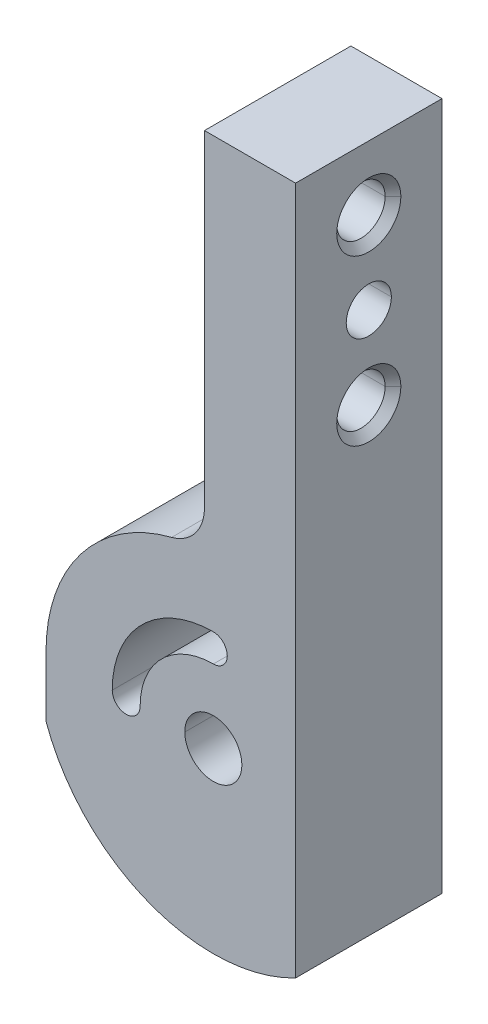
ISO-10303-21;
HEADER;
FILE_DESCRIPTION(('STEP AP214'),'2;1');
FILE_NAME('part.step','',(''),(''),'','','');
FILE_SCHEMA(('AUTOMOTIVE_DESIGN { 1 0 10303 214 1 1 1 1 }'));
ENDSEC;
DATA;
#1=APPLICATION_CONTEXT('core data for automotive mechanical design processes');
#2=APPLICATION_PROTOCOL_DEFINITION('international standard','automotive_design',2000,#1);
#3=PRODUCT_CONTEXT('',#1,'mechanical');
#4=PRODUCT('Part','Part','',(#3));
#5=PRODUCT_RELATED_PRODUCT_CATEGORY('part','',(#4));
#6=PRODUCT_DEFINITION_FORMATION('','',#4);
#7=PRODUCT_DEFINITION_CONTEXT('part definition',#1,'design');
#8=PRODUCT_DEFINITION('design','',#6,#7);
#9=PRODUCT_DEFINITION_SHAPE('','',#8);
#10=(LENGTH_UNIT() NAMED_UNIT(*) SI_UNIT(.MILLI.,.METRE.));
#11=(NAMED_UNIT(*) PLANE_ANGLE_UNIT() SI_UNIT($,.RADIAN.));
#12=(NAMED_UNIT(*) SI_UNIT($,.STERADIAN.) SOLID_ANGLE_UNIT());
#13=UNCERTAINTY_MEASURE_WITH_UNIT(LENGTH_MEASURE(1.E-05),#10,'distance_accuracy_value','');
#14=(GEOMETRIC_REPRESENTATION_CONTEXT(3) GLOBAL_UNCERTAINTY_ASSIGNED_CONTEXT((#13)) GLOBAL_UNIT_ASSIGNED_CONTEXT((#10,
#11,#12)) REPRESENTATION_CONTEXT('',''));
#15=CARTESIAN_POINT('',(0.,0.,0.));
#16=DIRECTION('',(0.,0.,1.));
#17=DIRECTION('',(1.,0.,0.));
#18=AXIS2_PLACEMENT_3D('',#15,#16,#17);
#19=CARTESIAN_POINT('',(-2.8702000000001,11.1686951126799,-8.001));
#20=DIRECTION('',(0.,0.,-1.));
#21=DIRECTION('',(-0.790221069832412,0.612821883415498,0.));
#22=AXIS2_PLACEMENT_3D('',#19,#20,#21);
#23=CYLINDRICAL_SURFACE('',#22,2.38760000000011);
#24=DIRECTION('',(0.,0.,1.));
#25=VECTOR('',#24,1.);
#26=CARTESIAN_POINT('',(-2.2759295154185,8.85623401005449,-8.001));
#27=LINE('',#26,#25);
#28=CARTESIAN_POINT('',(-2.2759295154185,8.85623401005449,-8.001));
#29=VERTEX_POINT('',#28);
#30=CARTESIAN_POINT('',(-2.2759295154185,8.85623401005449,0.));
#31=VERTEX_POINT('',#30);
#32=EDGE_CURVE('E11',#29,#31,#27,.T.);
#33=ORIENTED_EDGE('',*,*,#32,.T.);
#34=CARTESIAN_POINT('',(-2.8702000000001,11.1686951126799,0.));
#35=DIRECTION('',(0.,0.,1.));
#36=DIRECTION('',(1.,0.,0.));
#37=AXIS2_PLACEMENT_3D('',#34,#35,#36);
#38=CIRCLE('',#37,2.38760000000011);
#39=CARTESIAN_POINT('',(-0.4826,11.16869511268,0.));
#40=VERTEX_POINT('',#39);
#41=EDGE_CURVE('E25',#31,#40,#38,.T.);
#42=ORIENTED_EDGE('',*,*,#41,.T.);
#43=DIRECTION('',(0.,0.,1.));
#44=VECTOR('',#43,1.);
#45=CARTESIAN_POINT('',(-0.4826,11.16869511268,-8.001));
#46=LINE('',#45,#44);
#47=CARTESIAN_POINT('',(-0.4826,11.16869511268,-8.001));
#48=VERTEX_POINT('',#47);
#49=EDGE_CURVE('E793',#48,#40,#46,.T.);
#50=ORIENTED_EDGE('',*,*,#49,.F.);
#51=CARTESIAN_POINT('',(-2.8702000000001,11.1686951126799,-8.001));
#52=DIRECTION('',(0.,0.,1.));
#53=DIRECTION('',(1.,0.,0.));
#54=AXIS2_PLACEMENT_3D('',#51,#52,#53);
#55=CIRCLE('',#54,2.38760000000011);
#56=EDGE_CURVE('E788',#29,#48,#55,.T.);
#57=ORIENTED_EDGE('',*,*,#56,.F.);
#58=EDGE_LOOP('',(#33,#42,#50,#57));
#59=FACE_BOUND('',#58,.T.);
#60=ADVANCED_FACE('F17',(#59),#23,.F.);
#61=CARTESIAN_POINT('',(-2.5587171270658E-13,1.4658413372004E-13,-8.001));
#62=DIRECTION('',(0.,0.,1.));
#63=DIRECTION('',(1.,0.,0.));
#64=AXIS2_PLACEMENT_3D('',#61,#62,#63);
#65=PLANE('',#64);
#66=CARTESIAN_POINT('',(0.,4.7625,-8.001));
#67=DIRECTION('',(0.,0.,1.));
#68=DIRECTION('',(1.,0.,0.));
#69=AXIS2_PLACEMENT_3D('',#66,#67,#68);
#70=CIRCLE('',#69,0.762);
#71=CARTESIAN_POINT('',(0.,4.0005,-8.001));
#72=VERTEX_POINT('',#71);
#73=CARTESIAN_POINT('',(0.,5.5245,-8.001));
#74=VERTEX_POINT('',#73);
#75=EDGE_CURVE('E784',#72,#74,#70,.T.);
#76=ORIENTED_EDGE('',*,*,#75,.T.);
#77=CARTESIAN_POINT('',(0.,0.,-8.001));
#78=DIRECTION('',(0.,0.,1.));
#79=DIRECTION('',(1.,0.,0.));
#80=AXIS2_PLACEMENT_3D('',#77,#78,#79);
#81=CIRCLE('',#80,5.52449999999995);
#82=CARTESIAN_POINT('',(-5.5245,1.1354684584634E-08,-8.001));
#83=VERTEX_POINT('',#82);
#84=EDGE_CURVE('E780',#74,#83,#81,.T.);
#85=ORIENTED_EDGE('',*,*,#84,.T.);
#86=CARTESIAN_POINT('',(-4.7625,0.,-8.001));
#87=DIRECTION('',(0.,0.,1.));
#88=DIRECTION('',(1.,0.,0.));
#89=AXIS2_PLACEMENT_3D('',#86,#87,#88);
#90=CIRCLE('',#89,0.762);
#91=CARTESIAN_POINT('',(-4.0005,2.53898475151004E-08,-8.001));
#92=VERTEX_POINT('',#91);
#93=EDGE_CURVE('E776',#83,#92,#90,.T.);
#94=ORIENTED_EDGE('',*,*,#93,.T.);
#95=CARTESIAN_POINT('',(0.,0.,-8.001));
#96=DIRECTION('',(0.,0.,1.));
#97=DIRECTION('',(1.,0.,0.));
#98=AXIS2_PLACEMENT_3D('',#95,#96,#97);
#99=CIRCLE('',#98,4.00049999999995);
#100=EDGE_CURVE('E771',#72,#92,#99,.T.);
#101=ORIENTED_EDGE('',*,*,#100,.F.);
#102=EDGE_LOOP('',(#76,#85,#94,#101));
#103=FACE_BOUND('',#102,.T.);
#104=CARTESIAN_POINT('',(0.,0.,-8.001));
#105=DIRECTION('',(0.,0.,1.));
#106=DIRECTION('',(1.,0.,0.));
#107=AXIS2_PLACEMENT_3D('',#104,#105,#106);
#108=CIRCLE('',#107,1.55956);
#109=CARTESIAN_POINT('',(1.55956,0.,-8.001));
#110=VERTEX_POINT('',#109);
#111=CARTESIAN_POINT('',(-1.55956,0.,-8.001));
#112=VERTEX_POINT('',#111);
#113=EDGE_CURVE('E767',#110,#112,#108,.T.);
#114=ORIENTED_EDGE('',*,*,#113,.T.);
#115=CARTESIAN_POINT('',(0.,0.,-8.001));
#116=DIRECTION('',(0.,0.,1.));
#117=DIRECTION('',(1.,0.,0.));
#118=AXIS2_PLACEMENT_3D('',#115,#116,#117);
#119=CIRCLE('',#118,1.55956);
#120=EDGE_CURVE('E763',#112,#110,#119,.T.);
#121=ORIENTED_EDGE('',*,*,#120,.T.);
#122=EDGE_LOOP('',(#114,#121));
#123=FACE_BOUND('',#122,.T.);
#124=CARTESIAN_POINT('',(-2.5587171270658E-13,1.4658413372004E-13,-8.001));
#125=DIRECTION('',(0.,0.,1.));
#126=DIRECTION('',(1.,0.,0.));
#127=AXIS2_PLACEMENT_3D('',#124,#125,#126);
#128=CIRCLE('',#127,9.14399999999975);
#129=CARTESIAN_POINT('',(-9.144,0.,-8.001));
#130=VERTEX_POINT('',#129);
#131=EDGE_CURVE('E758',#29,#130,#128,.T.);
#132=ORIENTED_EDGE('',*,*,#131,.F.);
#133=ORIENTED_EDGE('',*,*,#56,.T.);
#134=DIRECTION('',(0.,-1.,0.));
#135=VECTOR('',#134,1.);
#136=CARTESIAN_POINT('',(-0.4826,29.0068,-8.001));
#137=LINE('',#136,#135);
#138=CARTESIAN_POINT('',(-0.4826,29.0068,-8.001));
#139=VERTEX_POINT('',#138);
#140=EDGE_CURVE('E753',#139,#48,#137,.T.);
#141=ORIENTED_EDGE('',*,*,#140,.F.);
#142=DIRECTION('',(-1.,0.,0.));
#143=VECTOR('',#142,1.);
#144=CARTESIAN_POINT('',(4.4958,29.0068,-8.001));
#145=LINE('',#144,#143);
#146=CARTESIAN_POINT('',(4.4958,29.0068,-8.001));
#147=VERTEX_POINT('',#146);
#148=EDGE_CURVE('E748',#147,#139,#145,.T.);
#149=ORIENTED_EDGE('',*,*,#148,.F.);
#150=DIRECTION('',(0.,1.,0.));
#151=VECTOR('',#150,1.);
#152=CARTESIAN_POINT('',(4.4958,-8.61270704308471,-8.001));
#153=LINE('',#152,#151);
#154=CARTESIAN_POINT('',(4.4958,-8.61270704308471,-8.001));
#155=VERTEX_POINT('',#154);
#156=EDGE_CURVE('E743',#155,#147,#153,.T.);
#157=ORIENTED_EDGE('',*,*,#156,.F.);
#158=CARTESIAN_POINT('',(0.,1.48318857196017E-13,-8.001));
#159=DIRECTION('',(0.,0.,1.));
#160=DIRECTION('',(1.,0.,0.));
#161=AXIS2_PLACEMENT_3D('',#158,#159,#160);
#162=CIRCLE('',#161,9.71550000000013);
#163=CARTESIAN_POINT('',(-9.144,-3.28301755249649,-8.001));
#164=VERTEX_POINT('',#163);
#165=EDGE_CURVE('E738',#164,#155,#162,.T.);
#166=ORIENTED_EDGE('',*,*,#165,.F.);
#167=DIRECTION('',(0.,-1.,0.));
#168=VECTOR('',#167,1.);
#169=CARTESIAN_POINT('',(-9.144,0.,-8.001));
#170=LINE('',#169,#168);
#171=EDGE_CURVE('E733',#130,#164,#170,.T.);
#172=ORIENTED_EDGE('',*,*,#171,.F.);
#173=EDGE_LOOP('',(#132,#133,#141,#149,#157,#166,#172));
#174=FACE_BOUND('',#173,.T.);
#175=ADVANCED_FACE('F815',(#103,#123,#174),#65,.F.);
#176=CARTESIAN_POINT('',(-9.144,0.,-8.001));
#177=DIRECTION('',(-1.,0.,0.));
#178=DIRECTION('',(0.,0.,1.));
#179=AXIS2_PLACEMENT_3D('',#176,#177,#178);
#180=PLANE('',#179);
#181=DIRECTION('',(0.,-1.,0.));
#182=VECTOR('',#181,1.);
#183=CARTESIAN_POINT('',(-9.144,0.,0.));
#184=LINE('',#183,#182);
#185=CARTESIAN_POINT('',(-9.144,0.,0.));
#186=VERTEX_POINT('',#185);
#187=CARTESIAN_POINT('',(-9.144,-3.28301755249649,0.));
#188=VERTEX_POINT('',#187);
#189=EDGE_CURVE('E728',#186,#188,#184,.T.);
#190=ORIENTED_EDGE('',*,*,#189,.F.);
#191=DIRECTION('',(0.,0.,1.));
#192=VECTOR('',#191,1.);
#193=CARTESIAN_POINT('',(-9.144,0.,-8.001));
#194=LINE('',#193,#192);
#195=EDGE_CURVE('E723',#130,#186,#194,.T.);
#196=ORIENTED_EDGE('',*,*,#195,.F.);
#197=ORIENTED_EDGE('',*,*,#171,.T.);
#198=DIRECTION('',(0.,0.,1.));
#199=VECTOR('',#198,1.);
#200=CARTESIAN_POINT('',(-9.144,-3.28301755249649,-8.001));
#201=LINE('',#200,#199);
#202=EDGE_CURVE('E719',#164,#188,#201,.T.);
#203=ORIENTED_EDGE('',*,*,#202,.T.);
#204=EDGE_LOOP('',(#190,#196,#197,#203));
#205=FACE_BOUND('',#204,.T.);
#206=ADVANCED_FACE('F825',(#205),#180,.T.);
#207=CARTESIAN_POINT('',(0.,1.48318857196017E-13,-8.001));
#208=DIRECTION('',(0.,0.,-1.));
#209=DIRECTION('',(0.363947844489257,0.931419329030498,0.));
#210=AXIS2_PLACEMENT_3D('',#207,#208,#209);
#211=CYLINDRICAL_SURFACE('',#210,9.71550000000013);
#212=CARTESIAN_POINT('',(0.,1.48318857196017E-13,0.));
#213=DIRECTION('',(0.,0.,1.));
#214=DIRECTION('',(1.,0.,0.));
#215=AXIS2_PLACEMENT_3D('',#212,#213,#214);
#216=CIRCLE('',#215,9.71550000000013);
#217=CARTESIAN_POINT('',(4.4958,-8.61270704308471,0.));
#218=VERTEX_POINT('',#217);
#219=EDGE_CURVE('E714',#188,#218,#216,.T.);
#220=ORIENTED_EDGE('',*,*,#219,.F.);
#221=ORIENTED_EDGE('',*,*,#202,.F.);
#222=ORIENTED_EDGE('',*,*,#165,.T.);
#223=DIRECTION('',(0.,0.,1.));
#224=VECTOR('',#223,1.);
#225=CARTESIAN_POINT('',(4.4958,-8.61270704308471,-8.001));
#226=LINE('',#225,#224);
#227=EDGE_CURVE('E710',#155,#218,#226,.T.);
#228=ORIENTED_EDGE('',*,*,#227,.T.);
#229=EDGE_LOOP('',(#220,#221,#222,#228));
#230=FACE_BOUND('',#229,.T.);
#231=ADVANCED_FACE('F821',(#230),#211,.T.);
#232=CARTESIAN_POINT('',(4.4958,-8.61270704308471,-8.001));
#233=DIRECTION('',(1.,0.,0.));
#234=DIRECTION('',(0.,0.,-1.));
#235=AXIS2_PLACEMENT_3D('',#232,#233,#234);
#236=PLANE('',#235);
#237=CARTESIAN_POINT('',(4.4958,21.0058,-4.0005));
#238=DIRECTION('',(1.,0.,0.));
#239=DIRECTION('',(0.,0.,-1.));
#240=AXIS2_PLACEMENT_3D('',#237,#238,#239);
#241=CIRCLE('',#240,1.23317);
#242=CARTESIAN_POINT('',(4.4958,21.0058,-5.23367));
#243=VERTEX_POINT('',#242);
#244=CARTESIAN_POINT('',(4.4958,21.0058,-2.76733));
#245=VERTEX_POINT('',#244);
#246=EDGE_CURVE('E705',#243,#245,#241,.T.);
#247=ORIENTED_EDGE('',*,*,#246,.F.);
#248=CARTESIAN_POINT('',(4.4958,21.0058,-4.0005));
#249=DIRECTION('',(1.,0.,0.));
#250=DIRECTION('',(0.,0.,-1.));
#251=AXIS2_PLACEMENT_3D('',#248,#249,#250);
#252=CIRCLE('',#251,1.23317);
#253=EDGE_CURVE('E700',#245,#243,#252,.T.);
#254=ORIENTED_EDGE('',*,*,#253,.F.);
#255=EDGE_LOOP('',(#247,#254));
#256=FACE_BOUND('',#255,.T.);
#257=CARTESIAN_POINT('',(4.4958,25.5016,-4.0005));
#258=DIRECTION('',(-1.,0.,0.));
#259=DIRECTION('',(0.,0.,1.));
#260=AXIS2_PLACEMENT_3D('',#257,#258,#259);
#261=CIRCLE('',#260,1.7526);
#262=CARTESIAN_POINT('',(4.4958,25.5016,-2.2479));
#263=VERTEX_POINT('',#262);
#264=CARTESIAN_POINT('',(4.4958,25.5016,-5.7531));
#265=VERTEX_POINT('',#264);
#266=EDGE_CURVE('E203',#263,#265,#261,.T.);
#267=ORIENTED_EDGE('',*,*,#266,.T.);
#268=CARTESIAN_POINT('',(4.4958,25.5016,-4.0005));
#269=DIRECTION('',(-1.,0.,0.));
#270=DIRECTION('',(0.,0.,1.));
#271=AXIS2_PLACEMENT_3D('',#268,#269,#270);
#272=CIRCLE('',#271,1.7526);
#273=EDGE_CURVE('E693',#265,#263,#272,.T.);
#274=ORIENTED_EDGE('',*,*,#273,.T.);
#275=EDGE_LOOP('',(#267,#274));
#276=FACE_BOUND('',#275,.T.);
#277=CARTESIAN_POINT('',(4.4958,16.51,-4.0005));
#278=DIRECTION('',(-1.,0.,0.));
#279=DIRECTION('',(0.,0.,1.));
#280=AXIS2_PLACEMENT_3D('',#277,#278,#279);
#281=CIRCLE('',#280,1.7526);
#282=CARTESIAN_POINT('',(4.4958,16.51,-2.2479));
#283=VERTEX_POINT('',#282);
#284=CARTESIAN_POINT('',(4.4958,16.51,-5.7531));
#285=VERTEX_POINT('',#284);
#286=EDGE_CURVE('E689',#283,#285,#281,.T.);
#287=ORIENTED_EDGE('',*,*,#286,.T.);
#288=CARTESIAN_POINT('',(4.4958,16.51,-4.0005));
#289=DIRECTION('',(-1.,0.,0.));
#290=DIRECTION('',(0.,0.,1.));
#291=AXIS2_PLACEMENT_3D('',#288,#289,#290);
#292=CIRCLE('',#291,1.7526);
#293=EDGE_CURVE('E685',#285,#283,#292,.T.);
#294=ORIENTED_EDGE('',*,*,#293,.T.);
#295=EDGE_LOOP('',(#287,#294));
#296=FACE_BOUND('',#295,.T.);
#297=DIRECTION('',(0.,1.,0.));
#298=VECTOR('',#297,1.);
#299=CARTESIAN_POINT('',(4.4958,-8.61270704308471,0.));
#300=LINE('',#299,#298);
#301=CARTESIAN_POINT('',(4.4958,29.0068,0.));
#302=VERTEX_POINT('',#301);
#303=EDGE_CURVE('E680',#218,#302,#300,.T.);
#304=ORIENTED_EDGE('',*,*,#303,.F.);
#305=ORIENTED_EDGE('',*,*,#227,.F.);
#306=ORIENTED_EDGE('',*,*,#156,.T.);
#307=DIRECTION('',(0.,0.,1.));
#308=VECTOR('',#307,1.);
#309=CARTESIAN_POINT('',(4.4958,29.0068,-8.001));
#310=LINE('',#309,#308);
#311=EDGE_CURVE('E676',#147,#302,#310,.T.);
#312=ORIENTED_EDGE('',*,*,#311,.T.);
#313=EDGE_LOOP('',(#304,#305,#306,#312));
#314=FACE_BOUND('',#313,.T.);
#315=ADVANCED_FACE('F818',(#256,#276,#296,#314),#236,.T.);
#316=CARTESIAN_POINT('',(4.4958,29.0068,-8.001));
#317=DIRECTION('',(0.,1.,0.));
#318=DIRECTION('',(0.,0.,1.));
#319=AXIS2_PLACEMENT_3D('',#316,#317,#318);
#320=PLANE('',#319);
#321=DIRECTION('',(-1.,0.,0.));
#322=VECTOR('',#321,1.);
#323=CARTESIAN_POINT('',(4.4958,29.0068,0.));
#324=LINE('',#323,#322);
#325=CARTESIAN_POINT('',(-0.4826,29.0068,0.));
#326=VERTEX_POINT('',#325);
#327=EDGE_CURVE('E671',#302,#326,#324,.T.);
#328=ORIENTED_EDGE('',*,*,#327,.F.);
#329=ORIENTED_EDGE('',*,*,#311,.F.);
#330=ORIENTED_EDGE('',*,*,#148,.T.);
#331=DIRECTION('',(0.,0.,1.));
#332=VECTOR('',#331,1.);
#333=CARTESIAN_POINT('',(-0.4826,29.0068,-8.001));
#334=LINE('',#333,#332);
#335=EDGE_CURVE('E667',#139,#326,#334,.T.);
#336=ORIENTED_EDGE('',*,*,#335,.T.);
#337=EDGE_LOOP('',(#328,#329,#330,#336));
#338=FACE_BOUND('',#337,.T.);
#339=ADVANCED_FACE('F812',(#338),#320,.T.);
#340=CARTESIAN_POINT('',(-0.4826,29.0068,-8.001));
#341=DIRECTION('',(-1.,0.,0.));
#342=DIRECTION('',(0.,0.,1.));
#343=AXIS2_PLACEMENT_3D('',#340,#341,#342);
#344=PLANE('',#343);
#345=CARTESIAN_POINT('',(-0.4826,21.0058,-4.0005));
#346=DIRECTION('',(1.,0.,0.));
#347=DIRECTION('',(0.,0.,-1.));
#348=AXIS2_PLACEMENT_3D('',#345,#346,#347);
#349=CIRCLE('',#348,1.23317);
#350=CARTESIAN_POINT('',(-0.4826,21.0058,-5.23367));
#351=VERTEX_POINT('',#350);
#352=CARTESIAN_POINT('',(-0.4826,21.0058,-2.76733));
#353=VERTEX_POINT('',#352);
#354=EDGE_CURVE('E663',#351,#353,#349,.T.);
#355=ORIENTED_EDGE('',*,*,#354,.T.);
#356=CARTESIAN_POINT('',(-0.4826,21.0058,-4.0005));
#357=DIRECTION('',(1.,0.,0.));
#358=DIRECTION('',(0.,0.,-1.));
#359=AXIS2_PLACEMENT_3D('',#356,#357,#358);
#360=CIRCLE('',#359,1.23317);
#361=EDGE_CURVE('E659',#353,#351,#360,.T.);
#362=ORIENTED_EDGE('',*,*,#361,.T.);
#363=EDGE_LOOP('',(#355,#362));
#364=FACE_BOUND('',#363,.T.);
#365=CARTESIAN_POINT('',(-0.482599999999959,25.5016,-4.0005));
#366=DIRECTION('',(-1.,0.,0.));
#367=DIRECTION('',(0.,0.,1.));
#368=AXIS2_PLACEMENT_3D('',#365,#366,#367);
#369=CIRCLE('',#368,1.7526);
#370=CARTESIAN_POINT('',(-0.482599999999959,25.5016,-2.2479));
#371=VERTEX_POINT('',#370);
#372=CARTESIAN_POINT('',(-0.48259999999996,25.5016,-5.7531));
#373=VERTEX_POINT('',#372);
#374=EDGE_CURVE('E655',#371,#373,#369,.T.);
#375=ORIENTED_EDGE('',*,*,#374,.F.);
#376=CARTESIAN_POINT('',(-0.482599999999959,25.5016,-4.0005));
#377=DIRECTION('',(-1.,0.,0.));
#378=DIRECTION('',(0.,0.,1.));
#379=AXIS2_PLACEMENT_3D('',#376,#377,#378);
#380=CIRCLE('',#379,1.7526);
#381=EDGE_CURVE('E651',#373,#371,#380,.T.);
#382=ORIENTED_EDGE('',*,*,#381,.F.);
#383=EDGE_LOOP('',(#375,#382));
#384=FACE_BOUND('',#383,.T.);
#385=CARTESIAN_POINT('',(-0.482599999999959,16.51,-4.0005));
#386=DIRECTION('',(-1.,0.,0.));
#387=DIRECTION('',(0.,0.,1.));
#388=AXIS2_PLACEMENT_3D('',#385,#386,#387);
#389=CIRCLE('',#388,1.7526);
#390=CARTESIAN_POINT('',(-0.482599999999959,16.51,-2.2479));
#391=VERTEX_POINT('',#390);
#392=CARTESIAN_POINT('',(-0.48259999999996,16.51,-5.7531));
#393=VERTEX_POINT('',#392);
#394=EDGE_CURVE('E647',#391,#393,#389,.T.);
#395=ORIENTED_EDGE('',*,*,#394,.F.);
#396=CARTESIAN_POINT('',(-0.482599999999959,16.51,-4.0005));
#397=DIRECTION('',(-1.,0.,0.));
#398=DIRECTION('',(0.,0.,1.));
#399=AXIS2_PLACEMENT_3D('',#396,#397,#398);
#400=CIRCLE('',#399,1.7526);
#401=EDGE_CURVE('E643',#393,#391,#400,.T.);
#402=ORIENTED_EDGE('',*,*,#401,.F.);
#403=EDGE_LOOP('',(#395,#402));
#404=FACE_BOUND('',#403,.T.);
#405=DIRECTION('',(0.,-1.,0.));
#406=VECTOR('',#405,1.);
#407=CARTESIAN_POINT('',(-0.4826,29.0068,0.));
#408=LINE('',#407,#406);
#409=EDGE_CURVE('E638',#326,#40,#408,.T.);
#410=ORIENTED_EDGE('',*,*,#409,.F.);
#411=ORIENTED_EDGE('',*,*,#335,.F.);
#412=ORIENTED_EDGE('',*,*,#140,.T.);
#413=ORIENTED_EDGE('',*,*,#49,.T.);
#414=EDGE_LOOP('',(#410,#411,#412,#413));
#415=FACE_BOUND('',#414,.T.);
#416=ADVANCED_FACE('F803',(#364,#384,#404,#415),#344,.T.);
#417=CARTESIAN_POINT('',(-2.5587171270658E-13,1.4658413372004E-13,0.));
#418=DIRECTION('',(0.,0.,1.));
#419=DIRECTION('',(1.,0.,0.));
#420=AXIS2_PLACEMENT_3D('',#417,#418,#419);
#421=PLANE('',#420);
#422=CARTESIAN_POINT('',(0.,0.,0.));
#423=DIRECTION('',(0.,0.,1.));
#424=DIRECTION('',(1.,0.,0.));
#425=AXIS2_PLACEMENT_3D('',#422,#423,#424);
#426=CIRCLE('',#425,5.52449999999995);
#427=CARTESIAN_POINT('',(0.,5.5245,0.));
#428=VERTEX_POINT('',#427);
#429=CARTESIAN_POINT('',(-5.5245,1.1354684584634E-08,0.));
#430=VERTEX_POINT('',#429);
#431=EDGE_CURVE('E633',#428,#430,#426,.T.);
#432=ORIENTED_EDGE('',*,*,#431,.F.);
#433=CARTESIAN_POINT('',(0.,4.7625,0.));
#434=DIRECTION('',(0.,0.,1.));
#435=DIRECTION('',(1.,0.,0.));
#436=AXIS2_PLACEMENT_3D('',#433,#434,#435);
#437=CIRCLE('',#436,0.762);
#438=CARTESIAN_POINT('',(0.,4.0005,0.));
#439=VERTEX_POINT('',#438);
#440=EDGE_CURVE('E628',#439,#428,#437,.T.);
#441=ORIENTED_EDGE('',*,*,#440,.F.);
#442=CARTESIAN_POINT('',(0.,0.,0.));
#443=DIRECTION('',(0.,0.,1.));
#444=DIRECTION('',(1.,0.,0.));
#445=AXIS2_PLACEMENT_3D('',#442,#443,#444);
#446=CIRCLE('',#445,4.00049999999995);
#447=CARTESIAN_POINT('',(-4.0005,2.53898475151004E-08,0.));
#448=VERTEX_POINT('',#447);
#449=EDGE_CURVE('E624',#439,#448,#446,.T.);
#450=ORIENTED_EDGE('',*,*,#449,.T.);
#451=CARTESIAN_POINT('',(-4.7625,0.,0.));
#452=DIRECTION('',(0.,0.,1.));
#453=DIRECTION('',(1.,0.,0.));
#454=AXIS2_PLACEMENT_3D('',#451,#452,#453);
#455=CIRCLE('',#454,0.762);
#456=EDGE_CURVE('E619',#430,#448,#455,.T.);
#457=ORIENTED_EDGE('',*,*,#456,.F.);
#458=EDGE_LOOP('',(#432,#441,#450,#457));
#459=FACE_BOUND('',#458,.T.);
#460=CARTESIAN_POINT('',(0.,0.,0.));
#461=DIRECTION('',(0.,0.,1.));
#462=DIRECTION('',(1.,0.,0.));
#463=AXIS2_PLACEMENT_3D('',#460,#461,#462);
#464=CIRCLE('',#463,1.55956);
#465=CARTESIAN_POINT('',(1.55956,0.,0.));
#466=VERTEX_POINT('',#465);
#467=CARTESIAN_POINT('',(-1.55956,0.,0.));
#468=VERTEX_POINT('',#467);
#469=EDGE_CURVE('E615',#466,#468,#464,.T.);
#470=ORIENTED_EDGE('',*,*,#469,.F.);
#471=CARTESIAN_POINT('',(0.,0.,0.));
#472=DIRECTION('',(0.,0.,1.));
#473=DIRECTION('',(1.,0.,0.));
#474=AXIS2_PLACEMENT_3D('',#471,#472,#473);
#475=CIRCLE('',#474,1.55956);
#476=EDGE_CURVE('E611',#468,#466,#475,.T.);
#477=ORIENTED_EDGE('',*,*,#476,.F.);
#478=EDGE_LOOP('',(#470,#477));
#479=FACE_BOUND('',#478,.T.);
#480=CARTESIAN_POINT('',(-2.5587171270658E-13,1.4658413372004E-13,0.));
#481=DIRECTION('',(0.,0.,1.));
#482=DIRECTION('',(1.,0.,0.));
#483=AXIS2_PLACEMENT_3D('',#480,#481,#482);
#484=CIRCLE('',#483,9.14399999999975);
#485=EDGE_CURVE('E608',#31,#186,#484,.T.);
#486=ORIENTED_EDGE('',*,*,#485,.T.);
#487=ORIENTED_EDGE('',*,*,#189,.T.);
#488=ORIENTED_EDGE('',*,*,#219,.T.);
#489=ORIENTED_EDGE('',*,*,#303,.T.);
#490=ORIENTED_EDGE('',*,*,#327,.T.);
#491=ORIENTED_EDGE('',*,*,#409,.T.);
#492=ORIENTED_EDGE('',*,*,#41,.F.);
#493=EDGE_LOOP('',(#486,#487,#488,#489,#490,#491,#492));
#494=FACE_BOUND('',#493,.T.);
#495=ADVANCED_FACE('F806',(#459,#479,#494),#421,.T.);
#496=CARTESIAN_POINT('',(-2.5587171270658E-13,1.4658413372004E-13,-8.001));
#497=DIRECTION('',(0.,0.,-1.));
#498=DIRECTION('',(0.790221069832389,-0.612821883415527,0.));
#499=AXIS2_PLACEMENT_3D('',#496,#497,#498);
#500=CYLINDRICAL_SURFACE('',#499,9.14399999999975);
#501=ORIENTED_EDGE('',*,*,#485,.F.);
#502=ORIENTED_EDGE('',*,*,#32,.F.);
#503=ORIENTED_EDGE('',*,*,#131,.T.);
#504=ORIENTED_EDGE('',*,*,#195,.T.);
#505=EDGE_LOOP('',(#501,#502,#503,#504));
#506=FACE_BOUND('',#505,.T.);
#507=ADVANCED_FACE('F827',(#506),#500,.T.);
#508=CARTESIAN_POINT('',(0.,0.,-8.001));
#509=DIRECTION('',(0.,0.,-1.));
#510=DIRECTION('',(0.,1.,0.));
#511=AXIS2_PLACEMENT_3D('',#508,#509,#510);
#512=CYLINDRICAL_SURFACE('',#511,1.55956);
#513=ORIENTED_EDGE('',*,*,#120,.F.);
#514=CARTESIAN_POINT('',(-1.55956,0.,0.));
#515=DIRECTION('',(0.,0.,-1.));
#516=VECTOR('',#515,1.);
#517=LINE('',#514,#516);
#518=EDGE_CURVE('E585',#468,#112,#517,.T.);
#519=ORIENTED_EDGE('',*,*,#518,.F.);
#520=ORIENTED_EDGE('',*,*,#476,.T.);
#521=CARTESIAN_POINT('',(1.55956,0.,0.));
#522=DIRECTION('',(0.,0.,-1.));
#523=VECTOR('',#522,1.);
#524=LINE('',#521,#523);
#525=EDGE_CURVE('E546',#466,#110,#524,.T.);
#526=ORIENTED_EDGE('',*,*,#525,.T.);
#527=EDGE_LOOP('',(#513,#519,#520,#526));
#528=FACE_BOUND('',#527,.T.);
#529=ADVANCED_FACE('F566',(#528),#512,.F.);
#530=CARTESIAN_POINT('',(0.,0.,-8.001));
#531=DIRECTION('',(0.,0.,-1.));
#532=DIRECTION('',(0.,-1.,0.));
#533=AXIS2_PLACEMENT_3D('',#530,#531,#532);
#534=CYLINDRICAL_SURFACE('',#533,1.55956);
#535=ORIENTED_EDGE('',*,*,#469,.T.);
#536=ORIENTED_EDGE('',*,*,#518,.T.);
#537=ORIENTED_EDGE('',*,*,#113,.F.);
#538=ORIENTED_EDGE('',*,*,#525,.F.);
#539=EDGE_LOOP('',(#535,#536,#537,#538));
#540=FACE_BOUND('',#539,.T.);
#541=ADVANCED_FACE('F555',(#540),#534,.F.);
#542=CARTESIAN_POINT('',(-4.7625,0.,-8.001));
#543=DIRECTION('',(0.,0.,-1.));
#544=DIRECTION('',(-1.22162874758822E-08,1.,0.));
#545=AXIS2_PLACEMENT_3D('',#542,#543,#544);
#546=CYLINDRICAL_SURFACE('',#545,0.762);
#547=DIRECTION('',(0.,0.,1.));
#548=VECTOR('',#547,1.);
#549=CARTESIAN_POINT('',(-5.5245,1.1354684584634E-08,-8.001));
#550=LINE('',#549,#548);
#551=EDGE_CURVE('E541',#83,#430,#550,.T.);
#552=ORIENTED_EDGE('',*,*,#551,.T.);
#553=ORIENTED_EDGE('',*,*,#456,.T.);
#554=DIRECTION('',(0.,0.,1.));
#555=VECTOR('',#554,1.);
#556=CARTESIAN_POINT('',(-4.0005,2.53898475151004E-08,-8.001));
#557=LINE('',#556,#555);
#558=EDGE_CURVE('E536',#92,#448,#557,.T.);
#559=ORIENTED_EDGE('',*,*,#558,.F.);
#560=ORIENTED_EDGE('',*,*,#93,.F.);
#561=EDGE_LOOP('',(#552,#553,#559,#560));
#562=FACE_BOUND('',#561,.T.);
#563=ADVANCED_FACE('F565',(#562),#546,.F.);
#564=CARTESIAN_POINT('',(0.,0.,-8.001));
#565=DIRECTION('',(0.,0.,-1.));
#566=DIRECTION('',(0.707106778942667,-0.707106783430429,0.));
#567=AXIS2_PLACEMENT_3D('',#564,#565,#566);
#568=CYLINDRICAL_SURFACE('',#567,4.00049999999995);
#569=ORIENTED_EDGE('',*,*,#449,.F.);
#570=DIRECTION('',(0.,0.,1.));
#571=VECTOR('',#570,1.);
#572=CARTESIAN_POINT('',(0.,4.0005,-8.001));
#573=LINE('',#572,#571);
#574=EDGE_CURVE('E531',#72,#439,#573,.T.);
#575=ORIENTED_EDGE('',*,*,#574,.F.);
#576=ORIENTED_EDGE('',*,*,#100,.T.);
#577=ORIENTED_EDGE('',*,*,#558,.T.);
#578=EDGE_LOOP('',(#569,#575,#576,#577));
#579=FACE_BOUND('',#578,.T.);
#580=ADVANCED_FACE('F871',(#579),#568,.T.);
#581=CARTESIAN_POINT('',(0.,4.7625,-8.001));
#582=DIRECTION('',(0.,0.,-1.));
#583=DIRECTION('',(-1.,0.,0.));
#584=AXIS2_PLACEMENT_3D('',#581,#582,#583);
#585=CYLINDRICAL_SURFACE('',#584,0.762);
#586=ORIENTED_EDGE('',*,*,#574,.T.);
#587=ORIENTED_EDGE('',*,*,#440,.T.);
#588=DIRECTION('',(0.,0.,1.));
#589=VECTOR('',#588,1.);
#590=CARTESIAN_POINT('',(0.,5.5245,-8.001));
#591=LINE('',#590,#589);
#592=EDGE_CURVE('E526',#74,#428,#591,.T.);
#593=ORIENTED_EDGE('',*,*,#592,.F.);
#594=ORIENTED_EDGE('',*,*,#75,.F.);
#595=EDGE_LOOP('',(#586,#587,#593,#594));
#596=FACE_BOUND('',#595,.T.);
#597=ADVANCED_FACE('F878',(#596),#585,.F.);
#598=CARTESIAN_POINT('',(0.,0.,-8.001));
#599=DIRECTION('',(0.,0.,-1.));
#600=DIRECTION('',(0.707106780459878,-0.707106781913217,0.));
#601=AXIS2_PLACEMENT_3D('',#598,#599,#600);
#602=CYLINDRICAL_SURFACE('',#601,5.52449999999995);
#603=ORIENTED_EDGE('',*,*,#592,.T.);
#604=ORIENTED_EDGE('',*,*,#431,.T.);
#605=ORIENTED_EDGE('',*,*,#551,.F.);
#606=ORIENTED_EDGE('',*,*,#84,.F.);
#607=EDGE_LOOP('',(#603,#604,#605,#606));
#608=FACE_BOUND('',#607,.T.);
#609=ADVANCED_FACE('F885',(#608),#602,.F.);
#610=CARTESIAN_POINT('',(-0.0533399999999599,16.51,-4.0005));
#611=DIRECTION('',(-1.,0.,0.));
#612=DIRECTION('',(0.,1.,0.));
#613=AXIS2_PLACEMENT_3D('',#610,#611,#612);
#614=CONICAL_SURFACE('',#613,1.32334,0.785398163397447);
#615=CARTESIAN_POINT('',(-0.0533399999999599,16.51,-4.0005));
#616=DIRECTION('',(-1.,0.,0.));
#617=DIRECTION('',(0.,0.,1.));
#618=AXIS2_PLACEMENT_3D('',#615,#616,#617);
#619=CIRCLE('',#618,1.32334);
#620=CARTESIAN_POINT('',(-0.0533399999999599,16.51,-5.32384));
#621=VERTEX_POINT('',#620);
#622=CARTESIAN_POINT('',(-0.0533399999999599,16.51,-2.67716));
#623=VERTEX_POINT('',#622);
#624=EDGE_CURVE('E524',#621,#623,#619,.T.);
#625=ORIENTED_EDGE('',*,*,#624,.F.);
#626=CARTESIAN_POINT('',(-0.0533399999999599,16.51,-5.32384));
#627=DIRECTION('',(-0.707106781186549,0.,-0.707106781186546));
#628=VECTOR('',#627,1.);
#629=LINE('',#626,#628);
#630=EDGE_CURVE('E502',#621,#393,#629,.T.);
#631=ORIENTED_EDGE('',*,*,#630,.T.);
#632=ORIENTED_EDGE('',*,*,#401,.T.);
#633=CARTESIAN_POINT('',(-0.0533399999999599,16.51,-2.67716));
#634=DIRECTION('',(-0.707106781186549,0.,0.707106781186546));
#635=VECTOR('',#634,1.);
#636=LINE('',#633,#635);
#637=EDGE_CURVE('E514',#623,#391,#636,.T.);
#638=ORIENTED_EDGE('',*,*,#637,.F.);
#639=EDGE_LOOP('',(#625,#631,#632,#638));
#640=FACE_BOUND('',#639,.T.);
#641=ADVANCED_FACE('F481',(#640),#614,.F.);
#642=CARTESIAN_POINT('',(-0.0533399999999599,16.51,-4.0005));
#643=DIRECTION('',(-1.,0.,0.));
#644=DIRECTION('',(0.,-1.,0.));
#645=AXIS2_PLACEMENT_3D('',#642,#643,#644);
#646=CONICAL_SURFACE('',#645,1.32334,0.785398163397447);
#647=ORIENTED_EDGE('',*,*,#394,.T.);
#648=ORIENTED_EDGE('',*,*,#630,.F.);
#649=CARTESIAN_POINT('',(-0.0533399999999599,16.51,-4.0005));
#650=DIRECTION('',(-1.,0.,0.));
#651=DIRECTION('',(0.,0.,1.));
#652=AXIS2_PLACEMENT_3D('',#649,#650,#651);
#653=CIRCLE('',#652,1.32334);
#654=EDGE_CURVE('E1155',#623,#621,#653,.T.);
#655=ORIENTED_EDGE('',*,*,#654,.F.);
#656=ORIENTED_EDGE('',*,*,#637,.T.);
#657=EDGE_LOOP('',(#647,#648,#655,#656));
#658=FACE_BOUND('',#657,.T.);
#659=ADVANCED_FACE('F472',(#658),#646,.F.);
#660=CARTESIAN_POINT('',(-0.482599999999959,16.51,-4.0005));
#661=DIRECTION('',(1.,0.,0.));
#662=DIRECTION('',(0.,-1.,0.));
#663=AXIS2_PLACEMENT_3D('',#660,#661,#662);
#664=CYLINDRICAL_SURFACE('',#663,1.32334);
#665=ORIENTED_EDGE('',*,*,#654,.T.);
#666=CARTESIAN_POINT('',(-0.0533399999999599,16.51,-5.32384));
#667=DIRECTION('',(1.,0.,0.));
#668=VECTOR('',#667,1.);
#669=LINE('',#666,#668);
#670=CARTESIAN_POINT('',(4.06654,16.51,-5.32384));
#671=VERTEX_POINT('',#670);
#672=EDGE_CURVE('E436',#621,#671,#669,.T.);
#673=ORIENTED_EDGE('',*,*,#672,.T.);
#674=CARTESIAN_POINT('',(4.06654,16.51,-4.0005));
#675=DIRECTION('',(-1.,0.,0.));
#676=DIRECTION('',(0.,0.,1.));
#677=AXIS2_PLACEMENT_3D('',#674,#675,#676);
#678=CIRCLE('',#677,1.32334);
#679=CARTESIAN_POINT('',(4.06654,16.51,-2.67716));
#680=VERTEX_POINT('',#679);
#681=EDGE_CURVE('E454',#680,#671,#678,.T.);
#682=ORIENTED_EDGE('',*,*,#681,.F.);
#683=CARTESIAN_POINT('',(-0.0533399999999599,16.51,-2.67716));
#684=DIRECTION('',(1.,0.,0.));
#685=VECTOR('',#684,1.);
#686=LINE('',#683,#685);
#687=EDGE_CURVE('E439',#623,#680,#686,.T.);
#688=ORIENTED_EDGE('',*,*,#687,.F.);
#689=EDGE_LOOP('',(#665,#673,#682,#688));
#690=FACE_BOUND('',#689,.T.);
#691=ADVANCED_FACE('F419',(#690),#664,.F.);
#692=CARTESIAN_POINT('',(-0.482599999999959,16.51,-4.0005));
#693=DIRECTION('',(1.,0.,0.));
#694=DIRECTION('',(0.,1.,0.));
#695=AXIS2_PLACEMENT_3D('',#692,#693,#694);
#696=CYLINDRICAL_SURFACE('',#695,1.32334);
#697=CARTESIAN_POINT('',(4.06654,16.51,-4.0005));
#698=DIRECTION('',(-1.,0.,0.));
#699=DIRECTION('',(0.,0.,1.));
#700=AXIS2_PLACEMENT_3D('',#697,#698,#699);
#701=CIRCLE('',#700,1.32334);
#702=EDGE_CURVE('E437',#671,#680,#701,.T.);
#703=ORIENTED_EDGE('',*,*,#702,.F.);
#704=ORIENTED_EDGE('',*,*,#672,.F.);
#705=ORIENTED_EDGE('',*,*,#624,.T.);
#706=ORIENTED_EDGE('',*,*,#687,.T.);
#707=EDGE_LOOP('',(#703,#704,#705,#706));
#708=FACE_BOUND('',#707,.T.);
#709=ADVANCED_FACE('F410',(#708),#696,.F.);
#710=CARTESIAN_POINT('',(4.4958,16.51,-4.0005));
#711=DIRECTION('',(1.,0.,0.));
#712=DIRECTION('',(0.,1.,0.));
#713=AXIS2_PLACEMENT_3D('',#710,#711,#712);
#714=CONICAL_SURFACE('',#713,1.7526,0.785398163397446);
#715=ORIENTED_EDGE('',*,*,#293,.F.);
#716=CARTESIAN_POINT('',(4.06654,16.51,-5.32384));
#717=DIRECTION('',(0.707106781186549,0.,-0.707106781186546));
#718=VECTOR('',#717,1.);
#719=LINE('',#716,#718);
#720=EDGE_CURVE('E382',#671,#285,#719,.T.);
#721=ORIENTED_EDGE('',*,*,#720,.F.);
#722=ORIENTED_EDGE('',*,*,#702,.T.);
#723=CARTESIAN_POINT('',(4.06654,16.51,-2.67716));
#724=DIRECTION('',(0.707106781186549,0.,0.707106781186546));
#725=VECTOR('',#724,1.);
#726=LINE('',#723,#725);
#727=EDGE_CURVE('E347',#680,#283,#726,.T.);
#728=ORIENTED_EDGE('',*,*,#727,.T.);
#729=EDGE_LOOP('',(#715,#721,#722,#728));
#730=FACE_BOUND('',#729,.T.);
#731=ADVANCED_FACE('F364',(#730),#714,.F.);
#732=CARTESIAN_POINT('',(4.4958,16.51,-4.0005));
#733=DIRECTION('',(1.,0.,0.));
#734=DIRECTION('',(0.,-1.,0.));
#735=AXIS2_PLACEMENT_3D('',#732,#733,#734);
#736=CONICAL_SURFACE('',#735,1.7526,0.785398163397446);
#737=ORIENTED_EDGE('',*,*,#681,.T.);
#738=ORIENTED_EDGE('',*,*,#720,.T.);
#739=ORIENTED_EDGE('',*,*,#286,.F.);
#740=ORIENTED_EDGE('',*,*,#727,.F.);
#741=EDGE_LOOP('',(#737,#738,#739,#740));
#742=FACE_BOUND('',#741,.T.);
#743=ADVANCED_FACE('F355',(#742),#736,.F.);
#744=CARTESIAN_POINT('',(-0.053340000000207,25.5016,-4.0005));
#745=DIRECTION('',(-1.,0.,0.));
#746=DIRECTION('',(0.,1.,0.));
#747=AXIS2_PLACEMENT_3D('',#744,#745,#746);
#748=CONICAL_SURFACE('',#747,1.32333999999999,0.785398163397741);
#749=CARTESIAN_POINT('',(-0.053340000000207,25.5016,-4.0005));
#750=DIRECTION('',(-1.,0.,0.));
#751=DIRECTION('',(0.,0.,1.));
#752=AXIS2_PLACEMENT_3D('',#749,#750,#751);
#753=CIRCLE('',#752,1.32333999999999);
#754=CARTESIAN_POINT('',(-0.0533400000002069,25.5016,-5.32383999999999));
#755=VERTEX_POINT('',#754);
#756=CARTESIAN_POINT('',(-0.053340000000207,25.5016,-2.67716));
#757=VERTEX_POINT('',#756);
#758=EDGE_CURVE('E188',#755,#757,#753,.T.);
#759=ORIENTED_EDGE('',*,*,#758,.F.);
#760=CARTESIAN_POINT('',(-0.0533400000002069,25.5016,-5.32383999999999));
#761=DIRECTION('',(-0.707106781186341,0.,-0.707106781186754));
#762=VECTOR('',#761,1.);
#763=LINE('',#760,#762);
#764=EDGE_CURVE('E324',#755,#373,#763,.T.);
#765=ORIENTED_EDGE('',*,*,#764,.T.);
#766=ORIENTED_EDGE('',*,*,#381,.T.);
#767=CARTESIAN_POINT('',(-0.0533400000002069,25.5016,-2.67716));
#768=DIRECTION('',(-0.707106781186341,0.,0.707106781186754));
#769=VECTOR('',#768,1.);
#770=LINE('',#767,#769);
#771=EDGE_CURVE('E336',#757,#371,#770,.T.);
#772=ORIENTED_EDGE('',*,*,#771,.F.);
#773=EDGE_LOOP('',(#759,#765,#766,#772));
#774=FACE_BOUND('',#773,.T.);
#775=ADVANCED_FACE('F303',(#774),#748,.F.);
#776=CARTESIAN_POINT('',(-0.053340000000207,25.5016,-4.0005));
#777=DIRECTION('',(-1.,0.,0.));
#778=DIRECTION('',(0.,-1.,0.));
#779=AXIS2_PLACEMENT_3D('',#776,#777,#778);
#780=CONICAL_SURFACE('',#779,1.32333999999999,0.785398163397741);
#781=ORIENTED_EDGE('',*,*,#374,.T.);
#782=ORIENTED_EDGE('',*,*,#764,.F.);
#783=CARTESIAN_POINT('',(-0.053340000000207,25.5016,-4.0005));
#784=DIRECTION('',(-1.,0.,0.));
#785=DIRECTION('',(0.,0.,1.));
#786=AXIS2_PLACEMENT_3D('',#783,#784,#785);
#787=CIRCLE('',#786,1.32333999999999);
#788=EDGE_CURVE('E1157',#757,#755,#787,.T.);
#789=ORIENTED_EDGE('',*,*,#788,.F.);
#790=ORIENTED_EDGE('',*,*,#771,.T.);
#791=EDGE_LOOP('',(#781,#782,#789,#790));
#792=FACE_BOUND('',#791,.T.);
#793=ADVANCED_FACE('F294',(#792),#780,.F.);
#794=CARTESIAN_POINT('',(-0.4826,25.5016,-4.0005));
#795=DIRECTION('',(1.,0.,0.));
#796=DIRECTION('',(0.,-1.,0.));
#797=AXIS2_PLACEMENT_3D('',#794,#795,#796);
#798=CYLINDRICAL_SURFACE('',#797,1.32333999999999);
#799=ORIENTED_EDGE('',*,*,#788,.T.);
#800=CARTESIAN_POINT('',(-0.053340000000207,25.5016,-5.32383999999999));
#801=DIRECTION('',(1.,0.,0.));
#802=VECTOR('',#801,1.);
#803=LINE('',#800,#802);
#804=CARTESIAN_POINT('',(4.0665400000002,25.5016,-5.32383999999999));
#805=VERTEX_POINT('',#804);
#806=EDGE_CURVE('E175',#755,#805,#803,.T.);
#807=ORIENTED_EDGE('',*,*,#806,.T.);
#808=CARTESIAN_POINT('',(4.0665400000002,25.5016,-4.0005));
#809=DIRECTION('',(-1.,0.,0.));
#810=DIRECTION('',(0.,0.,1.));
#811=AXIS2_PLACEMENT_3D('',#808,#809,#810);
#812=CIRCLE('',#811,1.32333999999999);
#813=CARTESIAN_POINT('',(4.0665400000002,25.5016,-2.67716));
#814=VERTEX_POINT('',#813);
#815=EDGE_CURVE('E167',#814,#805,#812,.T.);
#816=ORIENTED_EDGE('',*,*,#815,.F.);
#817=CARTESIAN_POINT('',(-0.053340000000207,25.5016,-2.67716));
#818=DIRECTION('',(1.,0.,0.));
#819=VECTOR('',#818,1.);
#820=LINE('',#817,#819);
#821=EDGE_CURVE('E171',#757,#814,#820,.T.);
#822=ORIENTED_EDGE('',*,*,#821,.F.);
#823=EDGE_LOOP('',(#799,#807,#816,#822));
#824=FACE_BOUND('',#823,.T.);
#825=ADVANCED_FACE('F170',(#824),#798,.F.);
#826=CARTESIAN_POINT('',(-0.4826,25.5016,-4.0005));
#827=DIRECTION('',(1.,0.,0.));
#828=DIRECTION('',(0.,1.,0.));
#829=AXIS2_PLACEMENT_3D('',#826,#827,#828);
#830=CYLINDRICAL_SURFACE('',#829,1.32333999999999);
#831=CARTESIAN_POINT('',(4.0665400000002,25.5016,-4.0005));
#832=DIRECTION('',(-1.,0.,0.));
#833=DIRECTION('',(0.,0.,1.));
#834=AXIS2_PLACEMENT_3D('',#831,#832,#833);
#835=CIRCLE('',#834,1.32333999999999);
#836=EDGE_CURVE('E186',#805,#814,#835,.T.);
#837=ORIENTED_EDGE('',*,*,#836,.F.);
#838=ORIENTED_EDGE('',*,*,#806,.F.);
#839=ORIENTED_EDGE('',*,*,#758,.T.);
#840=ORIENTED_EDGE('',*,*,#821,.T.);
#841=EDGE_LOOP('',(#837,#838,#839,#840));
#842=FACE_BOUND('',#841,.T.);
#843=ADVANCED_FACE('F185',(#842),#830,.F.);
#844=CARTESIAN_POINT('',(4.4958,25.5016,-4.0005));
#845=DIRECTION('',(1.,0.,0.));
#846=DIRECTION('',(0.,1.,0.));
#847=AXIS2_PLACEMENT_3D('',#844,#845,#846);
#848=CONICAL_SURFACE('',#847,1.7526,0.785398163397686);
#849=ORIENTED_EDGE('',*,*,#273,.F.);
#850=CARTESIAN_POINT('',(4.0665400000002,25.5016,-5.32384));
#851=DIRECTION('',(0.70710678118638,0.,-0.707106781186715));
#852=VECTOR('',#851,1.);
#853=LINE('',#850,#852);
#854=EDGE_CURVE('E198',#805,#265,#853,.T.);
#855=ORIENTED_EDGE('',*,*,#854,.F.);
#856=ORIENTED_EDGE('',*,*,#836,.T.);
#857=CARTESIAN_POINT('',(4.0665400000002,25.5016,-2.67716));
#858=DIRECTION('',(0.70710678118638,0.,0.707106781186715));
#859=VECTOR('',#858,1.);
#860=LINE('',#857,#859);
#861=EDGE_CURVE('E195',#814,#263,#860,.T.);
#862=ORIENTED_EDGE('',*,*,#861,.T.);
#863=EDGE_LOOP('',(#849,#855,#856,#862));
#864=FACE_BOUND('',#863,.T.);
#865=ADVANCED_FACE('F194',(#864),#848,.F.);
#866=CARTESIAN_POINT('',(4.4958,25.5016,-4.0005));
#867=DIRECTION('',(1.,0.,0.));
#868=DIRECTION('',(0.,-1.,0.));
#869=AXIS2_PLACEMENT_3D('',#866,#867,#868);
#870=CONICAL_SURFACE('',#869,1.7526,0.785398163397686);
#871=ORIENTED_EDGE('',*,*,#815,.T.);
#872=ORIENTED_EDGE('',*,*,#854,.T.);
#873=ORIENTED_EDGE('',*,*,#266,.F.);
#874=ORIENTED_EDGE('',*,*,#861,.F.);
#875=EDGE_LOOP('',(#871,#872,#873,#874));
#876=FACE_BOUND('',#875,.T.);
#877=ADVANCED_FACE('F202',(#876),#870,.F.);
#878=CARTESIAN_POINT('',(-0.4826,21.0058,-4.0005));
#879=DIRECTION('',(-1.,0.,0.));
#880=DIRECTION('',(0.,1.,0.));
#881=AXIS2_PLACEMENT_3D('',#878,#879,#880);
#882=CYLINDRICAL_SURFACE('',#881,1.23317);
#883=ORIENTED_EDGE('',*,*,#361,.F.);
#884=CARTESIAN_POINT('',(4.4958,21.0058,-2.76733));
#885=DIRECTION('',(-1.,0.,0.));
#886=VECTOR('',#885,1.);
#887=LINE('',#884,#886);
#888=EDGE_CURVE('E204',#245,#353,#887,.T.);
#889=ORIENTED_EDGE('',*,*,#888,.F.);
#890=ORIENTED_EDGE('',*,*,#253,.T.);
#891=CARTESIAN_POINT('',(4.4958,21.0058,-5.23367));
#892=DIRECTION('',(-1.,0.,0.));
#893=VECTOR('',#892,1.);
#894=LINE('',#891,#893);
#895=EDGE_CURVE('E1132',#243,#351,#894,.T.);
#896=ORIENTED_EDGE('',*,*,#895,.T.);
#897=EDGE_LOOP('',(#883,#889,#890,#896));
#898=FACE_BOUND('',#897,.T.);
#899=ADVANCED_FACE('F224',(#898),#882,.F.);
#900=CARTESIAN_POINT('',(-0.4826,21.0058,-4.0005));
#901=DIRECTION('',(-1.,0.,0.));
#902=DIRECTION('',(0.,-1.,0.));
#903=AXIS2_PLACEMENT_3D('',#900,#901,#902);
#904=CYLINDRICAL_SURFACE('',#903,1.23317);
#905=ORIENTED_EDGE('',*,*,#246,.T.);
#906=ORIENTED_EDGE('',*,*,#888,.T.);
#907=ORIENTED_EDGE('',*,*,#354,.F.);
#908=ORIENTED_EDGE('',*,*,#895,.F.);
#909=EDGE_LOOP('',(#905,#906,#907,#908));
#910=FACE_BOUND('',#909,.T.);
#911=ADVANCED_FACE('F952',(#910),#904,.F.);
#912=CLOSED_SHELL('',(#60,#175,#206,#231,#315,#339,#416,#495,#507,#529,#541,#563,#580,#597,#609,
#641,#659,#691,#709,#731,#743,#775,#793,#825,#843,#865,#877,#899,#911));
#913=MANIFOLD_SOLID_BREP('B1',#912);
#914=ADVANCED_BREP_SHAPE_REPRESENTATION('',(#18,#913),#14);
#915=SHAPE_DEFINITION_REPRESENTATION(#9,#914);
ENDSEC;
END-ISO-10303-21;
